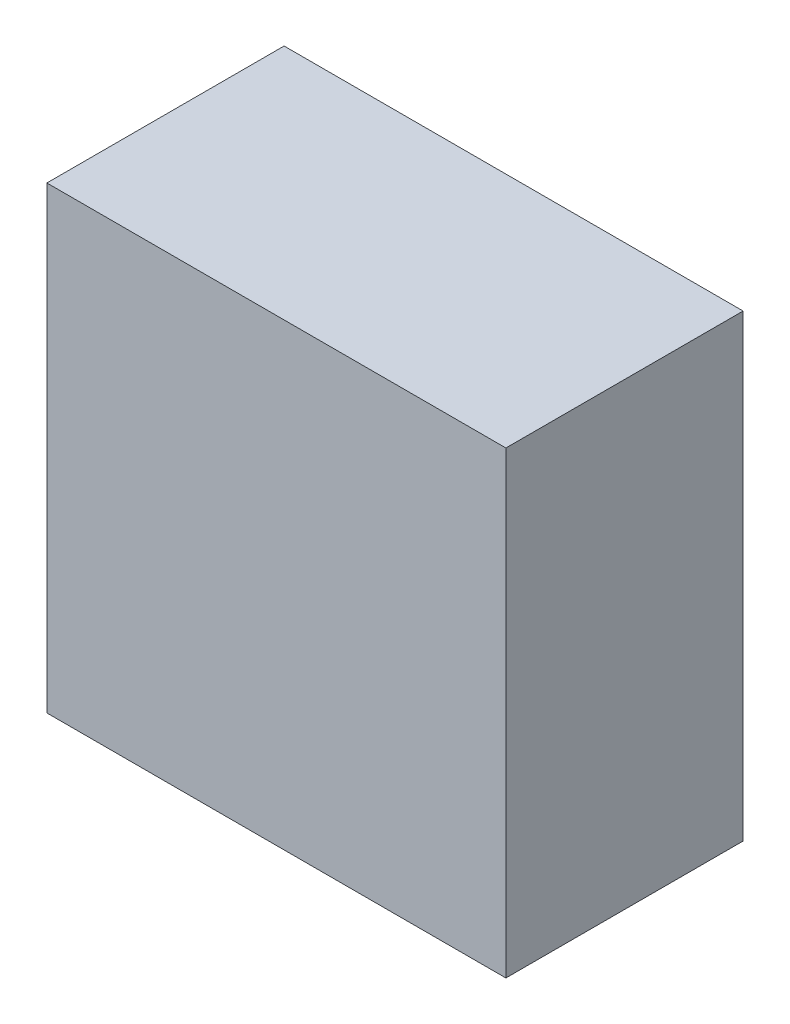
ISO-10303-21;
HEADER;
FILE_DESCRIPTION(('STEP AP214'),'2;1');
FILE_NAME('part.step','',(''),(''),'','','');
FILE_SCHEMA(('AUTOMOTIVE_DESIGN { 1 0 10303 214 1 1 1 1 }'));
ENDSEC;
DATA;
#1=APPLICATION_CONTEXT('core data for automotive mechanical design processes');
#2=APPLICATION_PROTOCOL_DEFINITION('international standard','automotive_design',2000,#1);
#3=PRODUCT_CONTEXT('',#1,'mechanical');
#4=PRODUCT('Part','Part','',(#3));
#5=PRODUCT_RELATED_PRODUCT_CATEGORY('part','',(#4));
#6=PRODUCT_DEFINITION_FORMATION('','',#4);
#7=PRODUCT_DEFINITION_CONTEXT('part definition',#1,'design');
#8=PRODUCT_DEFINITION('design','',#6,#7);
#9=PRODUCT_DEFINITION_SHAPE('','',#8);
#10=(LENGTH_UNIT() NAMED_UNIT(*) SI_UNIT(.MILLI.,.METRE.));
#11=(NAMED_UNIT(*) PLANE_ANGLE_UNIT() SI_UNIT($,.RADIAN.));
#12=(NAMED_UNIT(*) SI_UNIT($,.STERADIAN.) SOLID_ANGLE_UNIT());
#13=UNCERTAINTY_MEASURE_WITH_UNIT(LENGTH_MEASURE(1.E-05),#10,'distance_accuracy_value','');
#14=(GEOMETRIC_REPRESENTATION_CONTEXT(3) GLOBAL_UNCERTAINTY_ASSIGNED_CONTEXT((#13)) GLOBAL_UNIT_ASSIGNED_CONTEXT((#10,
#11,#12)) REPRESENTATION_CONTEXT('',''));
#15=CARTESIAN_POINT('',(0.,0.,0.));
#16=DIRECTION('',(0.,0.,1.));
#17=DIRECTION('',(1.,0.,0.));
#18=AXIS2_PLACEMENT_3D('',#15,#16,#17);
#19=CARTESIAN_POINT('',(0.,0.,20.75));
#20=DIRECTION('',(-1.,0.,0.));
#21=DIRECTION('',(0.,0.,1.));
#22=AXIS2_PLACEMENT_3D('',#19,#20,#21);
#23=PLANE('',#22);
#24=DIRECTION('',(0.,1.,0.));
#25=VECTOR('',#24,1.);
#26=CARTESIAN_POINT('',(0.,0.,0.));
#27=LINE('',#26,#25);
#28=CARTESIAN_POINT('',(0.,0.,0.));
#29=VERTEX_POINT('',#28);
#30=CARTESIAN_POINT('',(0.,40.15,0.));
#31=VERTEX_POINT('',#30);
#32=EDGE_CURVE('E98',#29,#31,#27,.T.);
#33=ORIENTED_EDGE('',*,*,#32,.F.);
#34=DIRECTION('',(0.,0.,-1.));
#35=VECTOR('',#34,1.);
#36=CARTESIAN_POINT('',(0.,0.,20.75));
#37=LINE('',#36,#35);
#38=CARTESIAN_POINT('',(0.,0.,20.75));
#39=VERTEX_POINT('',#38);
#40=EDGE_CURVE('E11',#39,#29,#37,.T.);
#41=ORIENTED_EDGE('',*,*,#40,.F.);
#42=DIRECTION('',(0.,1.,0.));
#43=VECTOR('',#42,1.);
#44=CARTESIAN_POINT('',(0.,0.,20.75));
#45=LINE('',#44,#43);
#46=CARTESIAN_POINT('',(0.,40.15,20.75));
#47=VERTEX_POINT('',#46);
#48=EDGE_CURVE('E93',#39,#47,#45,.T.);
#49=ORIENTED_EDGE('',*,*,#48,.T.);
#50=DIRECTION('',(0.,0.,-1.));
#51=VECTOR('',#50,1.);
#52=CARTESIAN_POINT('',(0.,40.15,20.75));
#53=LINE('',#52,#51);
#54=EDGE_CURVE('E36',#47,#31,#53,.T.);
#55=ORIENTED_EDGE('',*,*,#54,.T.);
#56=EDGE_LOOP('',(#33,#41,#49,#55));
#57=FACE_BOUND('',#56,.T.);
#58=ADVANCED_FACE('F33',(#57),#23,.T.);
#59=CARTESIAN_POINT('',(0.,0.,20.75));
#60=DIRECTION('',(0.,1.,0.));
#61=DIRECTION('',(0.,0.,1.));
#62=AXIS2_PLACEMENT_3D('',#59,#60,#61);
#63=PLANE('',#62);
#64=DIRECTION('',(1.,0.,0.));
#65=VECTOR('',#64,1.);
#66=CARTESIAN_POINT('',(0.,0.,0.));
#67=LINE('',#66,#65);
#68=CARTESIAN_POINT('',(40.15,0.,0.));
#69=VERTEX_POINT('',#68);
#70=EDGE_CURVE('E66',#29,#69,#67,.T.);
#71=ORIENTED_EDGE('',*,*,#70,.T.);
#72=DIRECTION('',(0.,0.,-1.));
#73=VECTOR('',#72,1.);
#74=CARTESIAN_POINT('',(40.15,0.,20.75));
#75=LINE('',#74,#73);
#76=CARTESIAN_POINT('',(40.15,0.,20.75));
#77=VERTEX_POINT('',#76);
#78=EDGE_CURVE('E42',#77,#69,#75,.T.);
#79=ORIENTED_EDGE('',*,*,#78,.F.);
#80=DIRECTION('',(1.,0.,0.));
#81=VECTOR('',#80,1.);
#82=CARTESIAN_POINT('',(0.,0.,20.75));
#83=LINE('',#82,#81);
#84=EDGE_CURVE('E83',#39,#77,#83,.T.);
#85=ORIENTED_EDGE('',*,*,#84,.F.);
#86=ORIENTED_EDGE('',*,*,#40,.T.);
#87=EDGE_LOOP('',(#71,#79,#85,#86));
#88=FACE_BOUND('',#87,.T.);
#89=ADVANCED_FACE('F108',(#88),#63,.F.);
#90=CARTESIAN_POINT('',(40.15,0.,20.75));
#91=DIRECTION('',(-1.,0.,0.));
#92=DIRECTION('',(0.,0.,1.));
#93=AXIS2_PLACEMENT_3D('',#90,#91,#92);
#94=PLANE('',#93);
#95=DIRECTION('',(0.,1.,0.));
#96=VECTOR('',#95,1.);
#97=CARTESIAN_POINT('',(40.15,0.,0.));
#98=LINE('',#97,#96);
#99=CARTESIAN_POINT('',(40.15,40.15,0.));
#100=VERTEX_POINT('',#99);
#101=EDGE_CURVE('E90',#69,#100,#98,.T.);
#102=ORIENTED_EDGE('',*,*,#101,.T.);
#103=DIRECTION('',(0.,0.,-1.));
#104=VECTOR('',#103,1.);
#105=CARTESIAN_POINT('',(40.15,40.15,20.75));
#106=LINE('',#105,#104);
#107=CARTESIAN_POINT('',(40.15,40.15,20.75));
#108=VERTEX_POINT('',#107);
#109=EDGE_CURVE('E87',#108,#100,#106,.T.);
#110=ORIENTED_EDGE('',*,*,#109,.F.);
#111=DIRECTION('',(0.,1.,0.));
#112=VECTOR('',#111,1.);
#113=CARTESIAN_POINT('',(40.15,0.,20.75));
#114=LINE('',#113,#112);
#115=EDGE_CURVE('E78',#77,#108,#114,.T.);
#116=ORIENTED_EDGE('',*,*,#115,.F.);
#117=ORIENTED_EDGE('',*,*,#78,.T.);
#118=EDGE_LOOP('',(#102,#110,#116,#117));
#119=FACE_BOUND('',#118,.T.);
#120=ADVANCED_FACE('F88',(#119),#94,.F.);
#121=CARTESIAN_POINT('',(0.,40.15,20.75));
#122=DIRECTION('',(0.,1.,0.));
#123=DIRECTION('',(0.,0.,1.));
#124=AXIS2_PLACEMENT_3D('',#121,#122,#123);
#125=PLANE('',#124);
#126=DIRECTION('',(1.,0.,0.));
#127=VECTOR('',#126,1.);
#128=CARTESIAN_POINT('',(0.,40.15,0.));
#129=LINE('',#128,#127);
#130=EDGE_CURVE('E101',#31,#100,#129,.T.);
#131=ORIENTED_EDGE('',*,*,#130,.F.);
#132=ORIENTED_EDGE('',*,*,#54,.F.);
#133=DIRECTION('',(1.,0.,0.));
#134=VECTOR('',#133,1.);
#135=CARTESIAN_POINT('',(0.,40.15,20.75));
#136=LINE('',#135,#134);
#137=EDGE_CURVE('E82',#47,#108,#136,.T.);
#138=ORIENTED_EDGE('',*,*,#137,.T.);
#139=ORIENTED_EDGE('',*,*,#109,.T.);
#140=EDGE_LOOP('',(#131,#132,#138,#139));
#141=FACE_BOUND('',#140,.T.);
#142=ADVANCED_FACE('F92',(#141),#125,.T.);
#143=CARTESIAN_POINT('',(0.,0.,20.75));
#144=DIRECTION('',(0.,0.,-1.));
#145=DIRECTION('',(-1.,0.,0.));
#146=AXIS2_PLACEMENT_3D('',#143,#144,#145);
#147=PLANE('',#146);
#148=ORIENTED_EDGE('',*,*,#48,.F.);
#149=ORIENTED_EDGE('',*,*,#84,.T.);
#150=ORIENTED_EDGE('',*,*,#115,.T.);
#151=ORIENTED_EDGE('',*,*,#137,.F.);
#152=EDGE_LOOP('',(#148,#149,#150,#151));
#153=FACE_BOUND('',#152,.T.);
#154=ADVANCED_FACE('F81',(#153),#147,.F.);
#155=CARTESIAN_POINT('',(0.,0.,0.));
#156=DIRECTION('',(0.,0.,-1.));
#157=DIRECTION('',(-1.,0.,0.));
#158=AXIS2_PLACEMENT_3D('',#155,#156,#157);
#159=PLANE('',#158);
#160=ORIENTED_EDGE('',*,*,#32,.T.);
#161=ORIENTED_EDGE('',*,*,#130,.T.);
#162=ORIENTED_EDGE('',*,*,#101,.F.);
#163=ORIENTED_EDGE('',*,*,#70,.F.);
#164=EDGE_LOOP('',(#160,#161,#162,#163));
#165=FACE_BOUND('',#164,.T.);
#166=ADVANCED_FACE('F106',(#165),#159,.T.);
#167=CLOSED_SHELL('',(#58,#89,#120,#142,#154,#166));
#168=MANIFOLD_SOLID_BREP('B2',#167);
#169=ADVANCED_BREP_SHAPE_REPRESENTATION('',(#18,#168),#14);
#170=SHAPE_DEFINITION_REPRESENTATION(#9,#169);
ENDSEC;
END-ISO-10303-21;
